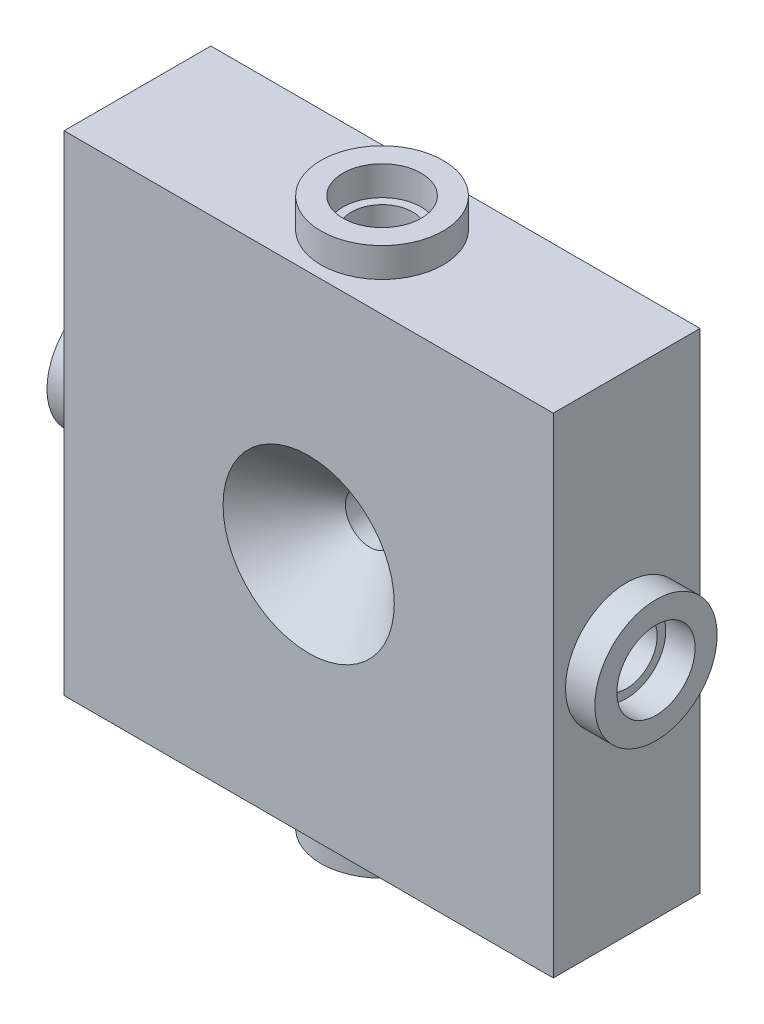
ISO-10303-21;
HEADER;
FILE_DESCRIPTION(('STEP AP214'),'2;1');
FILE_NAME('part.step','',(''),(''),'','','');
FILE_SCHEMA(('AUTOMOTIVE_DESIGN { 1 0 10303 214 1 1 1 1 }'));
ENDSEC;
DATA;
#1=APPLICATION_CONTEXT('core data for automotive mechanical design processes');
#2=APPLICATION_PROTOCOL_DEFINITION('international standard','automotive_design',2000,#1);
#3=PRODUCT_CONTEXT('',#1,'mechanical');
#4=PRODUCT('Part','Part','',(#3));
#5=PRODUCT_RELATED_PRODUCT_CATEGORY('part','',(#4));
#6=PRODUCT_DEFINITION_FORMATION('','',#4);
#7=PRODUCT_DEFINITION_CONTEXT('part definition',#1,'design');
#8=PRODUCT_DEFINITION('design','',#6,#7);
#9=PRODUCT_DEFINITION_SHAPE('','',#8);
#10=(LENGTH_UNIT() NAMED_UNIT(*) SI_UNIT(.MILLI.,.METRE.));
#11=(NAMED_UNIT(*) PLANE_ANGLE_UNIT() SI_UNIT($,.RADIAN.));
#12=(NAMED_UNIT(*) SI_UNIT($,.STERADIAN.) SOLID_ANGLE_UNIT());
#13=UNCERTAINTY_MEASURE_WITH_UNIT(LENGTH_MEASURE(1.E-05),#10,'distance_accuracy_value','');
#14=(GEOMETRIC_REPRESENTATION_CONTEXT(3) GLOBAL_UNCERTAINTY_ASSIGNED_CONTEXT((#13)) GLOBAL_UNIT_ASSIGNED_CONTEXT((#10,
#11,#12)) REPRESENTATION_CONTEXT('',''));
#15=CARTESIAN_POINT('',(0.,0.,0.));
#16=DIRECTION('',(0.,0.,1.));
#17=DIRECTION('',(1.,0.,0.));
#18=AXIS2_PLACEMENT_3D('',#15,#16,#17);
#19=CARTESIAN_POINT('',(-11.2,0.,0.));
#20=DIRECTION('',(-1.,0.,0.));
#21=DIRECTION('',(0.,0.,1.));
#22=AXIS2_PLACEMENT_3D('',#19,#20,#21);
#23=PLANE('',#22);
#24=CARTESIAN_POINT('',(-11.2,0.,0.));
#25=DIRECTION('',(-1.,0.,0.));
#26=DIRECTION('',(0.,0.,1.));
#27=AXIS2_PLACEMENT_3D('',#24,#25,#26);
#28=CIRCLE('',#27,2.5);
#29=CARTESIAN_POINT('',(-11.2,0.,2.5));
#30=VERTEX_POINT('',#29);
#31=EDGE_CURVE('E11',#30,#30,#28,.T.);
#32=ORIENTED_EDGE('',*,*,#31,.T.);
#33=EDGE_LOOP('',(#32));
#34=FACE_BOUND('',#33,.T.);
#35=CARTESIAN_POINT('',(-11.2,0.,0.));
#36=DIRECTION('',(-1.,0.,0.));
#37=DIRECTION('',(0.,0.,1.));
#38=AXIS2_PLACEMENT_3D('',#35,#36,#37);
#39=CIRCLE('',#38,1.6);
#40=CARTESIAN_POINT('',(-11.2,0.,1.6));
#41=VERTEX_POINT('',#40);
#42=EDGE_CURVE('E55',#41,#41,#39,.T.);
#43=ORIENTED_EDGE('',*,*,#42,.F.);
#44=EDGE_LOOP('',(#43));
#45=FACE_BOUND('',#44,.T.);
#46=ADVANCED_FACE('F44',(#34,#45),#23,.T.);
#47=CARTESIAN_POINT('',(-10.,0.,0.));
#48=DIRECTION('',(-1.,0.,0.));
#49=DIRECTION('',(0.,0.,1.));
#50=AXIS2_PLACEMENT_3D('',#47,#48,#49);
#51=PLANE('',#50);
#52=CARTESIAN_POINT('',(-10.,0.,0.));
#53=DIRECTION('',(-1.,0.,0.));
#54=DIRECTION('',(0.,0.,1.));
#55=AXIS2_PLACEMENT_3D('',#52,#53,#54);
#56=CIRCLE('',#55,2.5);
#57=CARTESIAN_POINT('',(-10.,0.,2.5));
#58=VERTEX_POINT('',#57);
#59=EDGE_CURVE('E48',#58,#58,#56,.T.);
#60=ORIENTED_EDGE('',*,*,#59,.F.);
#61=EDGE_LOOP('',(#60));
#62=FACE_BOUND('',#61,.T.);
#63=CARTESIAN_POINT('',(-10.,0.,0.));
#64=DIRECTION('',(-1.,0.,0.));
#65=DIRECTION('',(0.,0.,1.));
#66=AXIS2_PLACEMENT_3D('',#63,#64,#65);
#67=CIRCLE('',#66,1.6);
#68=CARTESIAN_POINT('',(-10.,0.,1.6));
#69=VERTEX_POINT('',#68);
#70=EDGE_CURVE('E57',#69,#69,#67,.T.);
#71=ORIENTED_EDGE('',*,*,#70,.T.);
#72=EDGE_LOOP('',(#71));
#73=FACE_BOUND('',#72,.T.);
#74=ADVANCED_FACE('F67',(#62,#73),#51,.F.);
#75=CARTESIAN_POINT('',(-11.2,0.,0.));
#76=DIRECTION('',(1.,0.,0.));
#77=DIRECTION('',(0.,0.,-1.));
#78=AXIS2_PLACEMENT_3D('',#75,#76,#77);
#79=CYLINDRICAL_SURFACE('',#78,2.5);
#80=ORIENTED_EDGE('',*,*,#31,.F.);
#81=EDGE_LOOP('',(#80));
#82=FACE_BOUND('',#81,.T.);
#83=ORIENTED_EDGE('',*,*,#59,.T.);
#84=EDGE_LOOP('',(#83));
#85=FACE_BOUND('',#84,.T.);
#86=ADVANCED_FACE('F46',(#82,#85),#79,.T.);
#87=CARTESIAN_POINT('',(-11.2,0.,0.));
#88=DIRECTION('',(1.,0.,0.));
#89=DIRECTION('',(0.,0.,-1.));
#90=AXIS2_PLACEMENT_3D('',#87,#88,#89);
#91=CYLINDRICAL_SURFACE('',#90,1.6);
#92=ORIENTED_EDGE('',*,*,#42,.T.);
#93=EDGE_LOOP('',(#92));
#94=FACE_BOUND('',#93,.T.);
#95=ORIENTED_EDGE('',*,*,#70,.F.);
#96=EDGE_LOOP('',(#95));
#97=FACE_BOUND('',#96,.T.);
#98=ADVANCED_FACE('F63',(#94,#97),#91,.F.);
#99=CLOSED_SHELL('',(#46,#74,#86,#98));
#100=MANIFOLD_SOLID_BREP('B2',#99);
#101=CARTESIAN_POINT('',(1.05611801903282E-13,-11.2,0.));
#102=DIRECTION('',(0.,-1.,0.));
#103=DIRECTION('',(0.,0.,1.));
#104=AXIS2_PLACEMENT_3D('',#101,#102,#103);
#105=PLANE('',#104);
#106=CARTESIAN_POINT('',(1.05611801903282E-13,-11.2,0.));
#107=DIRECTION('',(0.,-1.,0.));
#108=DIRECTION('',(0.,0.,1.));
#109=AXIS2_PLACEMENT_3D('',#106,#107,#108);
#110=CIRCLE('',#109,2.5);
#111=CARTESIAN_POINT('',(1.05244407863538E-13,-11.2,2.5));
#112=VERTEX_POINT('',#111);
#113=EDGE_CURVE('E43',#112,#112,#110,.T.);
#114=ORIENTED_EDGE('',*,*,#113,.T.);
#115=EDGE_LOOP('',(#114));
#116=FACE_BOUND('',#115,.T.);
#117=CARTESIAN_POINT('',(1.05611801903282E-13,-11.2,0.));
#118=DIRECTION('',(0.,-1.,0.));
#119=DIRECTION('',(0.,0.,1.));
#120=AXIS2_PLACEMENT_3D('',#117,#118,#119);
#121=CIRCLE('',#120,1.6);
#122=CARTESIAN_POINT('',(1.05376669717846E-13,-11.2,1.6));
#123=VERTEX_POINT('',#122);
#124=EDGE_CURVE('E145',#123,#123,#121,.T.);
#125=ORIENTED_EDGE('',*,*,#124,.F.);
#126=EDGE_LOOP('',(#125));
#127=FACE_BOUND('',#126,.T.);
#128=ADVANCED_FACE('F134',(#116,#127),#105,.T.);
#129=CARTESIAN_POINT('',(1.05611801903282E-13,-10.,0.));
#130=DIRECTION('',(0.,-1.,0.));
#131=DIRECTION('',(0.,0.,1.));
#132=AXIS2_PLACEMENT_3D('',#129,#130,#131);
#133=PLANE('',#132);
#134=CARTESIAN_POINT('',(1.05611801903282E-13,-10.,0.));
#135=DIRECTION('',(0.,-1.,0.));
#136=DIRECTION('',(0.,0.,1.));
#137=AXIS2_PLACEMENT_3D('',#134,#135,#136);
#138=CIRCLE('',#137,2.5);
#139=CARTESIAN_POINT('',(1.05244407863538E-13,-10.,2.5));
#140=VERTEX_POINT('',#139);
#141=EDGE_CURVE('E138',#140,#140,#138,.T.);
#142=ORIENTED_EDGE('',*,*,#141,.F.);
#143=EDGE_LOOP('',(#142));
#144=FACE_BOUND('',#143,.T.);
#145=CARTESIAN_POINT('',(1.05611801903282E-13,-10.,0.));
#146=DIRECTION('',(0.,-1.,0.));
#147=DIRECTION('',(0.,0.,1.));
#148=AXIS2_PLACEMENT_3D('',#145,#146,#147);
#149=CIRCLE('',#148,1.6);
#150=CARTESIAN_POINT('',(1.05376669717846E-13,-10.,1.6));
#151=VERTEX_POINT('',#150);
#152=EDGE_CURVE('E147',#151,#151,#149,.T.);
#153=ORIENTED_EDGE('',*,*,#152,.T.);
#154=EDGE_LOOP('',(#153));
#155=FACE_BOUND('',#154,.T.);
#156=ADVANCED_FACE('F157',(#144,#155),#133,.F.);
#157=CARTESIAN_POINT('',(1.05611801903282E-13,-11.2,0.));
#158=DIRECTION('',(0.,1.,0.));
#159=DIRECTION('',(0.,0.,-1.));
#160=AXIS2_PLACEMENT_3D('',#157,#158,#159);
#161=CYLINDRICAL_SURFACE('',#160,2.5);
#162=ORIENTED_EDGE('',*,*,#113,.F.);
#163=EDGE_LOOP('',(#162));
#164=FACE_BOUND('',#163,.T.);
#165=ORIENTED_EDGE('',*,*,#141,.T.);
#166=EDGE_LOOP('',(#165));
#167=FACE_BOUND('',#166,.T.);
#168=ADVANCED_FACE('F136',(#164,#167),#161,.T.);
#169=CARTESIAN_POINT('',(1.05611801903282E-13,-11.2,0.));
#170=DIRECTION('',(0.,1.,0.));
#171=DIRECTION('',(0.,0.,-1.));
#172=AXIS2_PLACEMENT_3D('',#169,#170,#171);
#173=CYLINDRICAL_SURFACE('',#172,1.6);
#174=ORIENTED_EDGE('',*,*,#124,.T.);
#175=EDGE_LOOP('',(#174));
#176=FACE_BOUND('',#175,.T.);
#177=ORIENTED_EDGE('',*,*,#152,.F.);
#178=EDGE_LOOP('',(#177));
#179=FACE_BOUND('',#178,.T.);
#180=ADVANCED_FACE('F153',(#176,#179),#173,.F.);
#181=CLOSED_SHELL('',(#128,#156,#168,#180));
#182=MANIFOLD_SOLID_BREP('B6',#181);
#183=CARTESIAN_POINT('',(11.2,0.,0.));
#184=DIRECTION('',(1.,0.,0.));
#185=DIRECTION('',(0.,0.,1.));
#186=AXIS2_PLACEMENT_3D('',#183,#184,#185);
#187=PLANE('',#186);
#188=CARTESIAN_POINT('',(11.2,0.,0.));
#189=DIRECTION('',(1.,0.,0.));
#190=DIRECTION('',(0.,0.,1.));
#191=AXIS2_PLACEMENT_3D('',#188,#189,#190);
#192=CIRCLE('',#191,2.5);
#193=CARTESIAN_POINT('',(11.2,0.,2.5));
#194=VERTEX_POINT('',#193);
#195=EDGE_CURVE('E133',#194,#194,#192,.T.);
#196=ORIENTED_EDGE('',*,*,#195,.T.);
#197=EDGE_LOOP('',(#196));
#198=FACE_BOUND('',#197,.T.);
#199=CARTESIAN_POINT('',(11.2,0.,0.));
#200=DIRECTION('',(1.,0.,0.));
#201=DIRECTION('',(0.,0.,1.));
#202=AXIS2_PLACEMENT_3D('',#199,#200,#201);
#203=CIRCLE('',#202,1.6);
#204=CARTESIAN_POINT('',(11.2,0.,1.6));
#205=VERTEX_POINT('',#204);
#206=EDGE_CURVE('E235',#205,#205,#203,.T.);
#207=ORIENTED_EDGE('',*,*,#206,.F.);
#208=EDGE_LOOP('',(#207));
#209=FACE_BOUND('',#208,.T.);
#210=ADVANCED_FACE('F224',(#198,#209),#187,.T.);
#211=CARTESIAN_POINT('',(10.,0.,0.));
#212=DIRECTION('',(1.,0.,0.));
#213=DIRECTION('',(0.,0.,1.));
#214=AXIS2_PLACEMENT_3D('',#211,#212,#213);
#215=PLANE('',#214);
#216=CARTESIAN_POINT('',(10.,0.,0.));
#217=DIRECTION('',(1.,0.,0.));
#218=DIRECTION('',(0.,0.,1.));
#219=AXIS2_PLACEMENT_3D('',#216,#217,#218);
#220=CIRCLE('',#219,2.5);
#221=CARTESIAN_POINT('',(10.,0.,2.5));
#222=VERTEX_POINT('',#221);
#223=EDGE_CURVE('E228',#222,#222,#220,.T.);
#224=ORIENTED_EDGE('',*,*,#223,.F.);
#225=EDGE_LOOP('',(#224));
#226=FACE_BOUND('',#225,.T.);
#227=CARTESIAN_POINT('',(10.,0.,0.));
#228=DIRECTION('',(1.,0.,0.));
#229=DIRECTION('',(0.,0.,1.));
#230=AXIS2_PLACEMENT_3D('',#227,#228,#229);
#231=CIRCLE('',#230,1.6);
#232=CARTESIAN_POINT('',(10.,0.,1.6));
#233=VERTEX_POINT('',#232);
#234=EDGE_CURVE('E237',#233,#233,#231,.T.);
#235=ORIENTED_EDGE('',*,*,#234,.T.);
#236=EDGE_LOOP('',(#235));
#237=FACE_BOUND('',#236,.T.);
#238=ADVANCED_FACE('F247',(#226,#237),#215,.F.);
#239=CARTESIAN_POINT('',(11.2,0.,0.));
#240=DIRECTION('',(-1.,0.,0.));
#241=DIRECTION('',(0.,0.,-1.));
#242=AXIS2_PLACEMENT_3D('',#239,#240,#241);
#243=CYLINDRICAL_SURFACE('',#242,2.5);
#244=ORIENTED_EDGE('',*,*,#195,.F.);
#245=EDGE_LOOP('',(#244));
#246=FACE_BOUND('',#245,.T.);
#247=ORIENTED_EDGE('',*,*,#223,.T.);
#248=EDGE_LOOP('',(#247));
#249=FACE_BOUND('',#248,.T.);
#250=ADVANCED_FACE('F226',(#246,#249),#243,.T.);
#251=CARTESIAN_POINT('',(11.2,0.,0.));
#252=DIRECTION('',(-1.,0.,0.));
#253=DIRECTION('',(0.,0.,-1.));
#254=AXIS2_PLACEMENT_3D('',#251,#252,#253);
#255=CYLINDRICAL_SURFACE('',#254,1.6);
#256=ORIENTED_EDGE('',*,*,#206,.T.);
#257=EDGE_LOOP('',(#256));
#258=FACE_BOUND('',#257,.T.);
#259=ORIENTED_EDGE('',*,*,#234,.F.);
#260=EDGE_LOOP('',(#259));
#261=FACE_BOUND('',#260,.T.);
#262=ADVANCED_FACE('F243',(#258,#261),#255,.F.);
#263=CLOSED_SHELL('',(#210,#238,#250,#262));
#264=MANIFOLD_SOLID_BREP('B38',#263);
#265=CARTESIAN_POINT('',(-1.05611801903282E-13,11.2,0.));
#266=DIRECTION('',(0.,1.,0.));
#267=DIRECTION('',(0.,0.,1.));
#268=AXIS2_PLACEMENT_3D('',#265,#266,#267);
#269=PLANE('',#268);
#270=CARTESIAN_POINT('',(-1.05611801903282E-13,11.2,0.));
#271=DIRECTION('',(0.,1.,0.));
#272=DIRECTION('',(0.,0.,1.));
#273=AXIS2_PLACEMENT_3D('',#270,#271,#272);
#274=CIRCLE('',#273,2.5);
#275=CARTESIAN_POINT('',(-1.05611801903282E-13,11.2,2.5));
#276=VERTEX_POINT('',#275);
#277=EDGE_CURVE('E223',#276,#276,#274,.T.);
#278=ORIENTED_EDGE('',*,*,#277,.T.);
#279=EDGE_LOOP('',(#278));
#280=FACE_BOUND('',#279,.T.);
#281=CARTESIAN_POINT('',(-1.05611801903282E-13,11.2,0.));
#282=DIRECTION('',(0.,1.,0.));
#283=DIRECTION('',(0.,0.,1.));
#284=AXIS2_PLACEMENT_3D('',#281,#282,#283);
#285=CIRCLE('',#284,1.6);
#286=CARTESIAN_POINT('',(-1.05611801903282E-13,11.2,1.6));
#287=VERTEX_POINT('',#286);
#288=EDGE_CURVE('E326',#287,#287,#285,.T.);
#289=ORIENTED_EDGE('',*,*,#288,.F.);
#290=EDGE_LOOP('',(#289));
#291=FACE_BOUND('',#290,.T.);
#292=ADVANCED_FACE('F315',(#280,#291),#269,.T.);
#293=CARTESIAN_POINT('',(-1.05611801903282E-13,10.,0.));
#294=DIRECTION('',(0.,1.,0.));
#295=DIRECTION('',(0.,0.,1.));
#296=AXIS2_PLACEMENT_3D('',#293,#294,#295);
#297=PLANE('',#296);
#298=CARTESIAN_POINT('',(-1.05611801903282E-13,10.,0.));
#299=DIRECTION('',(0.,1.,0.));
#300=DIRECTION('',(0.,0.,1.));
#301=AXIS2_PLACEMENT_3D('',#298,#299,#300);
#302=CIRCLE('',#301,2.5);
#303=CARTESIAN_POINT('',(-1.05611801903282E-13,10.,2.5));
#304=VERTEX_POINT('',#303);
#305=EDGE_CURVE('E319',#304,#304,#302,.T.);
#306=ORIENTED_EDGE('',*,*,#305,.F.);
#307=EDGE_LOOP('',(#306));
#308=FACE_BOUND('',#307,.T.);
#309=CARTESIAN_POINT('',(-1.05611801903282E-13,10.,0.));
#310=DIRECTION('',(0.,1.,0.));
#311=DIRECTION('',(0.,0.,1.));
#312=AXIS2_PLACEMENT_3D('',#309,#310,#311);
#313=CIRCLE('',#312,1.6);
#314=CARTESIAN_POINT('',(-1.05611801903282E-13,10.,1.6));
#315=VERTEX_POINT('',#314);
#316=EDGE_CURVE('E328',#315,#315,#313,.T.);
#317=ORIENTED_EDGE('',*,*,#316,.T.);
#318=EDGE_LOOP('',(#317));
#319=FACE_BOUND('',#318,.T.);
#320=ADVANCED_FACE('F338',(#308,#319),#297,.F.);
#321=CARTESIAN_POINT('',(-1.05611801903282E-13,11.2,0.));
#322=DIRECTION('',(0.,-1.,0.));
#323=DIRECTION('',(0.,0.,-1.));
#324=AXIS2_PLACEMENT_3D('',#321,#322,#323);
#325=CYLINDRICAL_SURFACE('',#324,2.5);
#326=ORIENTED_EDGE('',*,*,#277,.F.);
#327=EDGE_LOOP('',(#326));
#328=FACE_BOUND('',#327,.T.);
#329=ORIENTED_EDGE('',*,*,#305,.T.);
#330=EDGE_LOOP('',(#329));
#331=FACE_BOUND('',#330,.T.);
#332=ADVANCED_FACE('F317',(#328,#331),#325,.T.);
#333=CARTESIAN_POINT('',(-1.05611801903282E-13,11.2,0.));
#334=DIRECTION('',(0.,-1.,0.));
#335=DIRECTION('',(0.,0.,-1.));
#336=AXIS2_PLACEMENT_3D('',#333,#334,#335);
#337=CYLINDRICAL_SURFACE('',#336,1.6);
#338=ORIENTED_EDGE('',*,*,#288,.T.);
#339=EDGE_LOOP('',(#338));
#340=FACE_BOUND('',#339,.T.);
#341=ORIENTED_EDGE('',*,*,#316,.F.);
#342=EDGE_LOOP('',(#341));
#343=FACE_BOUND('',#342,.T.);
#344=ADVANCED_FACE('F334',(#340,#343),#337,.F.);
#345=CLOSED_SHELL('',(#292,#320,#332,#344));
#346=MANIFOLD_SOLID_BREP('B128',#345);
#347=CARTESIAN_POINT('',(0.,0.,3.));
#348=DIRECTION('',(0.,0.,-1.));
#349=DIRECTION('',(-1.,0.,0.));
#350=AXIS2_PLACEMENT_3D('',#347,#348,#349);
#351=CYLINDRICAL_SURFACE('',#350,1.);
#352=CARTESIAN_POINT('',(0.,0.,0.5));
#353=DIRECTION('',(0.,0.,-1.));
#354=DIRECTION('',(-1.,0.,0.));
#355=AXIS2_PLACEMENT_3D('',#352,#353,#354);
#356=CIRCLE('',#355,0.999999999999998);
#357=CARTESIAN_POINT('',(0.999999999999999,0.,0.5));
#358=VERTEX_POINT('',#357);
#359=EDGE_CURVE('E481',#358,#358,#356,.T.);
#360=ORIENTED_EDGE('',*,*,#359,.F.);
#361=EDGE_LOOP('',(#360));
#362=FACE_BOUND('',#361,.T.);
#363=CARTESIAN_POINT('',(0.,0.,-0.5));
#364=DIRECTION('',(0.,0.,-1.));
#365=DIRECTION('',(-1.,0.,0.));
#366=AXIS2_PLACEMENT_3D('',#363,#364,#365);
#367=CIRCLE('',#366,0.999999999999998);
#368=CARTESIAN_POINT('',(0.999999999999999,0.,-0.5));
#369=VERTEX_POINT('',#368);
#370=EDGE_CURVE('E463',#369,#369,#367,.T.);
#371=ORIENTED_EDGE('',*,*,#370,.T.);
#372=EDGE_LOOP('',(#371));
#373=FACE_BOUND('',#372,.T.);
#374=ADVANCED_FACE('F377',(#362,#373),#351,.F.);
#375=CARTESIAN_POINT('',(0.,0.,3.));
#376=DIRECTION('',(0.,0.,1.));
#377=DIRECTION('',(1.,0.,0.));
#378=AXIS2_PLACEMENT_3D('',#375,#376,#377);
#379=PLANE('',#378);
#380=CARTESIAN_POINT('',(0.,0.,3.));
#381=DIRECTION('',(0.,0.,-1.));
#382=DIRECTION('',(-1.,0.,0.));
#383=AXIS2_PLACEMENT_3D('',#380,#381,#382);
#384=CIRCLE('',#383,3.50000000000003);
#385=CARTESIAN_POINT('',(3.50000000000003,0.,3.));
#386=VERTEX_POINT('',#385);
#387=EDGE_CURVE('E478',#386,#386,#384,.T.);
#388=ORIENTED_EDGE('',*,*,#387,.T.);
#389=EDGE_LOOP('',(#388));
#390=FACE_BOUND('',#389,.T.);
#391=DIRECTION('',(0.,1.,0.));
#392=VECTOR('',#391,1.);
#393=CARTESIAN_POINT('',(10.,10.,3.));
#394=LINE('',#393,#392);
#395=CARTESIAN_POINT('',(10.,-10.,3.));
#396=VERTEX_POINT('',#395);
#397=CARTESIAN_POINT('',(10.,10.,3.));
#398=VERTEX_POINT('',#397);
#399=EDGE_CURVE('E484',#396,#398,#394,.T.);
#400=ORIENTED_EDGE('',*,*,#399,.T.);
#401=DIRECTION('',(-1.,0.,0.));
#402=VECTOR('',#401,1.);
#403=CARTESIAN_POINT('',(-10.,10.,3.));
#404=LINE('',#403,#402);
#405=CARTESIAN_POINT('',(-10.,10.,3.));
#406=VERTEX_POINT('',#405);
#407=EDGE_CURVE('E486',#398,#406,#404,.T.);
#408=ORIENTED_EDGE('',*,*,#407,.T.);
#409=DIRECTION('',(0.,-1.,0.));
#410=VECTOR('',#409,1.);
#411=CARTESIAN_POINT('',(-10.,10.,3.));
#412=LINE('',#411,#410);
#413=CARTESIAN_POINT('',(-10.,-10.,3.));
#414=VERTEX_POINT('',#413);
#415=EDGE_CURVE('E397',#406,#414,#412,.T.);
#416=ORIENTED_EDGE('',*,*,#415,.T.);
#417=DIRECTION('',(1.,0.,0.));
#418=VECTOR('',#417,1.);
#419=CARTESIAN_POINT('',(-10.,-10.,3.));
#420=LINE('',#419,#418);
#421=EDGE_CURVE('E392',#414,#396,#420,.T.);
#422=ORIENTED_EDGE('',*,*,#421,.T.);
#423=EDGE_LOOP('',(#400,#408,#416,#422));
#424=FACE_BOUND('',#423,.T.);
#425=ADVANCED_FACE('F509',(#390,#424),#379,.T.);
#426=CARTESIAN_POINT('',(10.,10.,3.));
#427=DIRECTION('',(-1.,0.,0.));
#428=DIRECTION('',(0.,-1.,0.));
#429=AXIS2_PLACEMENT_3D('',#426,#427,#428);
#430=PLANE('',#429);
#431=CARTESIAN_POINT('',(10.,0.,0.));
#432=DIRECTION('',(1.,0.,0.));
#433=DIRECTION('',(0.,0.,-1.));
#434=AXIS2_PLACEMENT_3D('',#431,#432,#433);
#435=CIRCLE('',#434,1.25);
#436=CARTESIAN_POINT('',(10.,0.,-1.25));
#437=VERTEX_POINT('',#436);
#438=EDGE_CURVE('E437',#437,#437,#435,.T.);
#439=ORIENTED_EDGE('',*,*,#438,.F.);
#440=EDGE_LOOP('',(#439));
#441=FACE_BOUND('',#440,.T.);
#442=DIRECTION('',(0.,0.,-1.));
#443=VECTOR('',#442,1.);
#444=CARTESIAN_POINT('',(10.,-10.,3.));
#445=LINE('',#444,#443);
#446=CARTESIAN_POINT('',(10.,-10.,-3.));
#447=VERTEX_POINT('',#446);
#448=EDGE_CURVE('E490',#396,#447,#445,.T.);
#449=ORIENTED_EDGE('',*,*,#448,.T.);
#450=DIRECTION('',(0.,1.,0.));
#451=VECTOR('',#450,1.);
#452=CARTESIAN_POINT('',(10.,10.,-3.));
#453=LINE('',#452,#451);
#454=CARTESIAN_POINT('',(10.,10.,-3.));
#455=VERTEX_POINT('',#454);
#456=EDGE_CURVE('E466',#447,#455,#453,.T.);
#457=ORIENTED_EDGE('',*,*,#456,.T.);
#458=DIRECTION('',(0.,0.,-1.));
#459=VECTOR('',#458,1.);
#460=CARTESIAN_POINT('',(10.,10.,3.));
#461=LINE('',#460,#459);
#462=EDGE_CURVE('E313',#398,#455,#461,.T.);
#463=ORIENTED_EDGE('',*,*,#462,.F.);
#464=ORIENTED_EDGE('',*,*,#399,.F.);
#465=EDGE_LOOP('',(#449,#457,#463,#464));
#466=FACE_BOUND('',#465,.T.);
#467=ADVANCED_FACE('F379',(#441,#466),#430,.F.);
#468=CARTESIAN_POINT('',(-10.,10.,3.));
#469=DIRECTION('',(0.,-1.,0.));
#470=DIRECTION('',(0.,0.,-1.));
#471=AXIS2_PLACEMENT_3D('',#468,#469,#470);
#472=PLANE('',#471);
#473=CARTESIAN_POINT('',(-1.05611801903282E-13,10.,0.));
#474=DIRECTION('',(0.,1.,0.));
#475=DIRECTION('',(0.,0.,1.));
#476=AXIS2_PLACEMENT_3D('',#473,#474,#475);
#477=CIRCLE('',#476,1.25);
#478=CARTESIAN_POINT('',(-1.05611801903282E-13,10.,1.25));
#479=VERTEX_POINT('',#478);
#480=EDGE_CURVE('E438',#479,#479,#477,.T.);
#481=ORIENTED_EDGE('',*,*,#480,.F.);
#482=EDGE_LOOP('',(#481));
#483=FACE_BOUND('',#482,.T.);
#484=ORIENTED_EDGE('',*,*,#462,.T.);
#485=DIRECTION('',(-1.,0.,0.));
#486=VECTOR('',#485,1.);
#487=CARTESIAN_POINT('',(-10.,10.,-3.));
#488=LINE('',#487,#486);
#489=CARTESIAN_POINT('',(-10.,10.,-3.));
#490=VERTEX_POINT('',#489);
#491=EDGE_CURVE('E469',#455,#490,#488,.T.);
#492=ORIENTED_EDGE('',*,*,#491,.T.);
#493=DIRECTION('',(0.,0.,-1.));
#494=VECTOR('',#493,1.);
#495=CARTESIAN_POINT('',(-10.,10.,3.));
#496=LINE('',#495,#494);
#497=EDGE_CURVE('E385',#406,#490,#496,.T.);
#498=ORIENTED_EDGE('',*,*,#497,.F.);
#499=ORIENTED_EDGE('',*,*,#407,.F.);
#500=EDGE_LOOP('',(#484,#492,#498,#499));
#501=FACE_BOUND('',#500,.T.);
#502=ADVANCED_FACE('F500',(#483,#501),#472,.F.);
#503=CARTESIAN_POINT('',(-10.,10.,3.));
#504=DIRECTION('',(1.,0.,0.));
#505=DIRECTION('',(0.,1.,0.));
#506=AXIS2_PLACEMENT_3D('',#503,#504,#505);
#507=PLANE('',#506);
#508=CARTESIAN_POINT('',(-10.,0.,0.));
#509=DIRECTION('',(-1.,0.,0.));
#510=DIRECTION('',(0.,0.,1.));
#511=AXIS2_PLACEMENT_3D('',#508,#509,#510);
#512=CIRCLE('',#511,1.25);
#513=CARTESIAN_POINT('',(-10.,0.,1.25));
#514=VERTEX_POINT('',#513);
#515=EDGE_CURVE('E454',#514,#514,#512,.T.);
#516=ORIENTED_EDGE('',*,*,#515,.F.);
#517=EDGE_LOOP('',(#516));
#518=FACE_BOUND('',#517,.T.);
#519=ORIENTED_EDGE('',*,*,#497,.T.);
#520=DIRECTION('',(0.,-1.,0.));
#521=VECTOR('',#520,1.);
#522=CARTESIAN_POINT('',(-10.,10.,-3.));
#523=LINE('',#522,#521);
#524=CARTESIAN_POINT('',(-10.,-10.,-3.));
#525=VERTEX_POINT('',#524);
#526=EDGE_CURVE('E472',#490,#525,#523,.T.);
#527=ORIENTED_EDGE('',*,*,#526,.T.);
#528=DIRECTION('',(0.,0.,-1.));
#529=VECTOR('',#528,1.);
#530=CARTESIAN_POINT('',(-10.,-10.,3.));
#531=LINE('',#530,#529);
#532=EDGE_CURVE('E492',#414,#525,#531,.T.);
#533=ORIENTED_EDGE('',*,*,#532,.F.);
#534=ORIENTED_EDGE('',*,*,#415,.F.);
#535=EDGE_LOOP('',(#519,#527,#533,#534));
#536=FACE_BOUND('',#535,.T.);
#537=ADVANCED_FACE('F495',(#518,#536),#507,.F.);
#538=CARTESIAN_POINT('',(-10.,-10.,3.));
#539=DIRECTION('',(0.,1.,0.));
#540=DIRECTION('',(0.,0.,1.));
#541=AXIS2_PLACEMENT_3D('',#538,#539,#540);
#542=PLANE('',#541);
#543=CARTESIAN_POINT('',(0.,-10.,0.));
#544=DIRECTION('',(0.,-1.,0.));
#545=DIRECTION('',(0.,0.,-1.));
#546=AXIS2_PLACEMENT_3D('',#543,#544,#545);
#547=CIRCLE('',#546,1.25);
#548=CARTESIAN_POINT('',(0.,-10.,-1.25));
#549=VERTEX_POINT('',#548);
#550=EDGE_CURVE('E448',#549,#549,#547,.T.);
#551=ORIENTED_EDGE('',*,*,#550,.F.);
#552=EDGE_LOOP('',(#551));
#553=FACE_BOUND('',#552,.T.);
#554=ORIENTED_EDGE('',*,*,#532,.T.);
#555=DIRECTION('',(1.,0.,0.));
#556=VECTOR('',#555,1.);
#557=CARTESIAN_POINT('',(-10.,-10.,-3.));
#558=LINE('',#557,#556);
#559=EDGE_CURVE('E475',#525,#447,#558,.T.);
#560=ORIENTED_EDGE('',*,*,#559,.T.);
#561=ORIENTED_EDGE('',*,*,#448,.F.);
#562=ORIENTED_EDGE('',*,*,#421,.F.);
#563=EDGE_LOOP('',(#554,#560,#561,#562));
#564=FACE_BOUND('',#563,.T.);
#565=ADVANCED_FACE('F506',(#553,#564),#542,.F.);
#566=CARTESIAN_POINT('',(0.,0.,3.));
#567=DIRECTION('',(0.,0.,1.));
#568=DIRECTION('',(1.,0.,0.));
#569=AXIS2_PLACEMENT_3D('',#566,#567,#568);
#570=CONICAL_SURFACE('',#569,3.50000000000003,0.785398163397454);
#571=CARTESIAN_POINT('',(0.999999999999999,0.,0.5));
#572=CARTESIAN_POINT('',(1.02604166666667,0.,0.526041666666667));
#573=CARTESIAN_POINT('',(1.05208333333333,0.,0.552083333333334));
#574=CARTESIAN_POINT('',(1.10416666666667,0.,0.604166666666667));
#575=CARTESIAN_POINT('',(1.13020833333333,0.,0.630208333333334));
#576=CARTESIAN_POINT('',(1.18229166666667,0.,0.682291666666667));
#577=CARTESIAN_POINT('',(1.20833333333333,0.,0.708333333333334));
#578=CARTESIAN_POINT('',(1.26041666666667,0.,0.760416666666667));
#579=CARTESIAN_POINT('',(1.28645833333334,0.,0.786458333333334));
#580=CARTESIAN_POINT('',(1.33854166666667,0.,0.838541666666667));
#581=CARTESIAN_POINT('',(1.36458333333334,0.,0.864583333333334));
#582=CARTESIAN_POINT('',(1.41666666666667,0.,0.916666666666667));
#583=CARTESIAN_POINT('',(1.44270833333334,0.,0.942708333333334));
#584=CARTESIAN_POINT('',(1.49479166666667,0.,0.994791666666667));
#585=CARTESIAN_POINT('',(1.52083333333334,0.,1.02083333333333));
#586=CARTESIAN_POINT('',(1.57291666666667,0.,1.07291666666667));
#587=CARTESIAN_POINT('',(1.59895833333334,0.,1.09895833333333));
#588=CARTESIAN_POINT('',(1.65104166666667,0.,1.15104166666667));
#589=CARTESIAN_POINT('',(1.67708333333334,0.,1.17708333333333));
#590=CARTESIAN_POINT('',(1.72916666666667,0.,1.22916666666667));
#591=CARTESIAN_POINT('',(1.75520833333334,0.,1.25520833333333));
#592=CARTESIAN_POINT('',(1.80729166666667,0.,1.30729166666667));
#593=CARTESIAN_POINT('',(1.83333333333334,0.,1.33333333333333));
#594=CARTESIAN_POINT('',(1.88541666666668,0.,1.38541666666667));
#595=CARTESIAN_POINT('',(1.91145833333334,0.,1.41145833333333));
#596=CARTESIAN_POINT('',(1.96354166666668,0.,1.46354166666667));
#597=CARTESIAN_POINT('',(1.98958333333334,0.,1.48958333333333));
#598=CARTESIAN_POINT('',(2.04166666666668,0.,1.54166666666667));
#599=CARTESIAN_POINT('',(2.06770833333334,0.,1.56770833333333));
#600=CARTESIAN_POINT('',(2.11979166666668,0.,1.61979166666667));
#601=CARTESIAN_POINT('',(2.14583333333334,0.,1.64583333333333));
#602=CARTESIAN_POINT('',(2.19791666666668,0.,1.69791666666667));
#603=CARTESIAN_POINT('',(2.22395833333335,0.,1.72395833333333));
#604=CARTESIAN_POINT('',(2.27604166666668,0.,1.77604166666667));
#605=CARTESIAN_POINT('',(2.30208333333335,0.,1.80208333333333));
#606=CARTESIAN_POINT('',(2.35416666666668,0.,1.85416666666667));
#607=CARTESIAN_POINT('',(2.38020833333335,0.,1.88020833333333));
#608=CARTESIAN_POINT('',(2.43229166666668,0.,1.93229166666667));
#609=CARTESIAN_POINT('',(2.45833333333335,0.,1.95833333333333));
#610=CARTESIAN_POINT('',(2.51041666666668,0.,2.01041666666667));
#611=CARTESIAN_POINT('',(2.53645833333335,0.,2.03645833333333));
#612=CARTESIAN_POINT('',(2.58854166666668,0.,2.08854166666667));
#613=CARTESIAN_POINT('',(2.61458333333335,0.,2.11458333333333));
#614=CARTESIAN_POINT('',(2.66666666666668,0.,2.16666666666667));
#615=CARTESIAN_POINT('',(2.69270833333335,0.,2.19270833333333));
#616=CARTESIAN_POINT('',(2.74479166666668,0.,2.24479166666667));
#617=CARTESIAN_POINT('',(2.77083333333335,0.,2.27083333333333));
#618=CARTESIAN_POINT('',(2.82291666666668,0.,2.32291666666667));
#619=CARTESIAN_POINT('',(2.84895833333335,0.,2.34895833333333));
#620=CARTESIAN_POINT('',(2.90104166666669,0.,2.40104166666667));
#621=CARTESIAN_POINT('',(2.92708333333335,0.,2.42708333333333));
#622=CARTESIAN_POINT('',(2.97916666666669,0.,2.47916666666667));
#623=CARTESIAN_POINT('',(3.00520833333335,0.,2.50520833333333));
#624=CARTESIAN_POINT('',(3.05729166666669,0.,2.55729166666667));
#625=CARTESIAN_POINT('',(3.08333333333335,0.,2.58333333333333));
#626=CARTESIAN_POINT('',(3.13541666666669,0.,2.63541666666667));
#627=CARTESIAN_POINT('',(3.16145833333336,0.,2.66145833333333));
#628=CARTESIAN_POINT('',(3.21354166666669,0.,2.71354166666667));
#629=CARTESIAN_POINT('',(3.23958333333336,0.,2.73958333333333));
#630=CARTESIAN_POINT('',(3.29166666666669,0.,2.79166666666667));
#631=CARTESIAN_POINT('',(3.31770833333336,0.,2.81770833333333));
#632=CARTESIAN_POINT('',(3.36979166666669,0.,2.86979166666667));
#633=CARTESIAN_POINT('',(3.39583333333336,0.,2.89583333333333));
#634=CARTESIAN_POINT('',(3.44791666666669,0.,2.94791666666667));
#635=CARTESIAN_POINT('',(3.47395833333336,0.,2.97395833333333));
#636=CARTESIAN_POINT('',(3.50000000000003,0.,3.));
#637=B_SPLINE_CURVE_WITH_KNOTS('',3,(#571,#572,#573,#574,#575,#576,#577,#578,#579,#580,#581,
#582,#583,#584,#585,#586,#587,#588,#589,#590,#591,#592,#593,#594,#595,#596,#597,#598,#599,#600,
#601,#602,#603,#604,#605,#606,#607,#608,#609,#610,#611,#612,#613,#614,#615,#616,#617,#618,#619,
#620,#621,#622,#623,#624,#625,#626,#627,#628,#629,#630,#631,#632,#633,#634,#635,#636),
.UNSPECIFIED.,.F.,.F.,(4,2,2,2,2,2,2,2,2,2,2,2,2,2,2,2,2,2,2,2,2,2,2,2,2,2,2,2,2,2,2,2,4),(0.,
0.110485434560399,0.220970869120798,0.331456303681196,0.441941738241594,0.552427172801993,
0.662912607362392,0.773398041922791,0.883883476483189,0.994368911043588,1.10485434560399,
1.21533978016439,1.32582521472478,1.43631064928518,1.54679608384558,1.65728151840598,
1.76776695296638,1.87825238752678,1.98873782208718,2.09922325664757,2.20970869120797,
2.32019412576837,2.43067956032877,2.54116499488917,2.65165042944957,2.76213586400997,
2.87262129857036,2.98310673313076,3.09359216769116,3.20407760225156,3.31456303681196,
3.42504847137236,3.53553390593276),.UNSPECIFIED.);
#638=EDGE_CURVE('BSEAM524',#358,#386,#637,.T.);
#639=ORIENTED_EDGE('',*,*,#359,.T.);
#640=ORIENTED_EDGE('',*,*,#387,.F.);
#641=ORIENTED_EDGE('',*,*,#638,.T.);
#642=ORIENTED_EDGE('',*,*,#638,.F.);
#643=EDGE_LOOP('',(#639,#641,#640,#642));
#644=FACE_BOUND('',#643,.T.);
#645=ADVANCED_FACE('F524',(#644),#570,.F.);
#646=CARTESIAN_POINT('',(0.,0.,-3.));
#647=DIRECTION('',(0.,0.,-1.));
#648=DIRECTION('',(1.,0.,0.));
#649=AXIS2_PLACEMENT_3D('',#646,#647,#648);
#650=PLANE('',#649);
#651=CARTESIAN_POINT('',(0.,0.,-3.));
#652=DIRECTION('',(0.,0.,-1.));
#653=DIRECTION('',(-1.,0.,0.));
#654=AXIS2_PLACEMENT_3D('',#651,#652,#653);
#655=CIRCLE('',#654,3.50000000000003);
#656=CARTESIAN_POINT('',(3.50000000000003,0.,-3.));
#657=VERTEX_POINT('',#656);
#658=EDGE_CURVE('E460',#657,#657,#655,.T.);
#659=ORIENTED_EDGE('',*,*,#658,.F.);
#660=EDGE_LOOP('',(#659));
#661=FACE_BOUND('',#660,.T.);
#662=ORIENTED_EDGE('',*,*,#456,.F.);
#663=ORIENTED_EDGE('',*,*,#559,.F.);
#664=ORIENTED_EDGE('',*,*,#526,.F.);
#665=ORIENTED_EDGE('',*,*,#491,.F.);
#666=EDGE_LOOP('',(#662,#663,#664,#665));
#667=FACE_BOUND('',#666,.T.);
#668=ADVANCED_FACE('F504',(#661,#667),#650,.T.);
#669=CARTESIAN_POINT('',(0.,0.,-3.));
#670=DIRECTION('',(0.,0.,-1.));
#671=DIRECTION('',(1.,0.,0.));
#672=AXIS2_PLACEMENT_3D('',#669,#670,#671);
#673=CONICAL_SURFACE('',#672,3.50000000000003,0.785398163397454);
#674=CARTESIAN_POINT('',(0.999999999999999,0.,-0.5));
#675=CARTESIAN_POINT('',(1.02604166666667,0.,-0.526041666666667));
#676=CARTESIAN_POINT('',(1.05208333333333,0.,-0.552083333333334));
#677=CARTESIAN_POINT('',(1.10416666666667,0.,-0.604166666666667));
#678=CARTESIAN_POINT('',(1.13020833333333,0.,-0.630208333333334));
#679=CARTESIAN_POINT('',(1.18229166666667,0.,-0.682291666666667));
#680=CARTESIAN_POINT('',(1.20833333333333,0.,-0.708333333333334));
#681=CARTESIAN_POINT('',(1.26041666666667,0.,-0.760416666666667));
#682=CARTESIAN_POINT('',(1.28645833333334,0.,-0.786458333333334));
#683=CARTESIAN_POINT('',(1.33854166666667,0.,-0.838541666666667));
#684=CARTESIAN_POINT('',(1.36458333333334,0.,-0.864583333333334));
#685=CARTESIAN_POINT('',(1.41666666666667,0.,-0.916666666666667));
#686=CARTESIAN_POINT('',(1.44270833333334,0.,-0.942708333333334));
#687=CARTESIAN_POINT('',(1.49479166666667,0.,-0.994791666666667));
#688=CARTESIAN_POINT('',(1.52083333333334,0.,-1.02083333333333));
#689=CARTESIAN_POINT('',(1.57291666666667,0.,-1.07291666666667));
#690=CARTESIAN_POINT('',(1.59895833333334,0.,-1.09895833333333));
#691=CARTESIAN_POINT('',(1.65104166666667,0.,-1.15104166666667));
#692=CARTESIAN_POINT('',(1.67708333333334,0.,-1.17708333333333));
#693=CARTESIAN_POINT('',(1.72916666666667,0.,-1.22916666666667));
#694=CARTESIAN_POINT('',(1.75520833333334,0.,-1.25520833333333));
#695=CARTESIAN_POINT('',(1.80729166666667,0.,-1.30729166666667));
#696=CARTESIAN_POINT('',(1.83333333333334,0.,-1.33333333333333));
#697=CARTESIAN_POINT('',(1.88541666666668,0.,-1.38541666666667));
#698=CARTESIAN_POINT('',(1.91145833333334,0.,-1.41145833333333));
#699=CARTESIAN_POINT('',(1.96354166666668,0.,-1.46354166666667));
#700=CARTESIAN_POINT('',(1.98958333333334,0.,-1.48958333333333));
#701=CARTESIAN_POINT('',(2.04166666666668,0.,-1.54166666666667));
#702=CARTESIAN_POINT('',(2.06770833333334,0.,-1.56770833333333));
#703=CARTESIAN_POINT('',(2.11979166666668,0.,-1.61979166666667));
#704=CARTESIAN_POINT('',(2.14583333333334,0.,-1.64583333333333));
#705=CARTESIAN_POINT('',(2.19791666666668,0.,-1.69791666666667));
#706=CARTESIAN_POINT('',(2.22395833333335,0.,-1.72395833333333));
#707=CARTESIAN_POINT('',(2.27604166666668,0.,-1.77604166666667));
#708=CARTESIAN_POINT('',(2.30208333333335,0.,-1.80208333333333));
#709=CARTESIAN_POINT('',(2.35416666666668,0.,-1.85416666666667));
#710=CARTESIAN_POINT('',(2.38020833333335,0.,-1.88020833333333));
#711=CARTESIAN_POINT('',(2.43229166666668,0.,-1.93229166666667));
#712=CARTESIAN_POINT('',(2.45833333333335,0.,-1.95833333333333));
#713=CARTESIAN_POINT('',(2.51041666666668,0.,-2.01041666666667));
#714=CARTESIAN_POINT('',(2.53645833333335,0.,-2.03645833333333));
#715=CARTESIAN_POINT('',(2.58854166666668,0.,-2.08854166666667));
#716=CARTESIAN_POINT('',(2.61458333333335,0.,-2.11458333333333));
#717=CARTESIAN_POINT('',(2.66666666666668,0.,-2.16666666666667));
#718=CARTESIAN_POINT('',(2.69270833333335,0.,-2.19270833333333));
#719=CARTESIAN_POINT('',(2.74479166666668,0.,-2.24479166666667));
#720=CARTESIAN_POINT('',(2.77083333333335,0.,-2.27083333333333));
#721=CARTESIAN_POINT('',(2.82291666666668,0.,-2.32291666666667));
#722=CARTESIAN_POINT('',(2.84895833333335,0.,-2.34895833333333));
#723=CARTESIAN_POINT('',(2.90104166666669,0.,-2.40104166666667));
#724=CARTESIAN_POINT('',(2.92708333333335,0.,-2.42708333333333));
#725=CARTESIAN_POINT('',(2.97916666666669,0.,-2.47916666666667));
#726=CARTESIAN_POINT('',(3.00520833333335,0.,-2.50520833333333));
#727=CARTESIAN_POINT('',(3.05729166666669,0.,-2.55729166666667));
#728=CARTESIAN_POINT('',(3.08333333333335,0.,-2.58333333333333));
#729=CARTESIAN_POINT('',(3.13541666666669,0.,-2.63541666666667));
#730=CARTESIAN_POINT('',(3.16145833333336,0.,-2.66145833333333));
#731=CARTESIAN_POINT('',(3.21354166666669,0.,-2.71354166666667));
#732=CARTESIAN_POINT('',(3.23958333333336,0.,-2.73958333333333));
#733=CARTESIAN_POINT('',(3.29166666666669,0.,-2.79166666666667));
#734=CARTESIAN_POINT('',(3.31770833333336,0.,-2.81770833333333));
#735=CARTESIAN_POINT('',(3.36979166666669,0.,-2.86979166666667));
#736=CARTESIAN_POINT('',(3.39583333333336,0.,-2.89583333333333));
#737=CARTESIAN_POINT('',(3.44791666666669,0.,-2.94791666666667));
#738=CARTESIAN_POINT('',(3.47395833333336,0.,-2.97395833333333));
#739=CARTESIAN_POINT('',(3.50000000000003,0.,-3.));
#740=B_SPLINE_CURVE_WITH_KNOTS('',3,(#674,#675,#676,#677,#678,#679,#680,#681,#682,#683,#684,
#685,#686,#687,#688,#689,#690,#691,#692,#693,#694,#695,#696,#697,#698,#699,#700,#701,#702,#703,
#704,#705,#706,#707,#708,#709,#710,#711,#712,#713,#714,#715,#716,#717,#718,#719,#720,#721,#722,
#723,#724,#725,#726,#727,#728,#729,#730,#731,#732,#733,#734,#735,#736,#737,#738,#739),
.UNSPECIFIED.,.F.,.F.,(4,2,2,2,2,2,2,2,2,2,2,2,2,2,2,2,2,2,2,2,2,2,2,2,2,2,2,2,2,2,2,2,4),(0.,
0.110485434560399,0.220970869120798,0.331456303681196,0.441941738241594,0.552427172801993,
0.662912607362392,0.773398041922791,0.883883476483189,0.994368911043588,1.10485434560399,
1.21533978016439,1.32582521472478,1.43631064928518,1.54679608384558,1.65728151840598,
1.76776695296638,1.87825238752678,1.98873782208718,2.09922325664757,2.20970869120797,
2.32019412576837,2.43067956032877,2.54116499488917,2.65165042944957,2.76213586400997,
2.87262129857036,2.98310673313076,3.09359216769116,3.20407760225156,3.31456303681196,
3.42504847137236,3.53553390593276),.UNSPECIFIED.);
#741=EDGE_CURVE('BSEAM561',#369,#657,#740,.T.);
#742=ORIENTED_EDGE('',*,*,#370,.F.);
#743=ORIENTED_EDGE('',*,*,#658,.T.);
#744=ORIENTED_EDGE('',*,*,#741,.T.);
#745=ORIENTED_EDGE('',*,*,#741,.F.);
#746=EDGE_LOOP('',(#742,#744,#743,#745));
#747=FACE_BOUND('',#746,.T.);
#748=ADVANCED_FACE('F561',(#747),#673,.F.);
#749=CARTESIAN_POINT('',(-4.00000000000001,0.,0.));
#750=DIRECTION('',(-1.,0.,0.));
#751=DIRECTION('',(0.,0.,1.));
#752=AXIS2_PLACEMENT_3D('',#749,#750,#751);
#753=CONICAL_SURFACE('',#752,1.25,1.02974425867665);
#754=CARTESIAN_POINT('',(-3.24892422621556,0.,0.));
#755=VERTEX_POINT('',#754);
#756=VERTEX_LOOP('',#755);
#757=FACE_BOUND('',#756,.T.);
#758=CARTESIAN_POINT('',(-4.00000000000001,0.,0.));
#759=DIRECTION('',(-1.,0.,0.));
#760=DIRECTION('',(0.,0.,1.));
#761=AXIS2_PLACEMENT_3D('',#758,#759,#760);
#762=CIRCLE('',#761,1.25);
#763=CARTESIAN_POINT('',(-4.00000000000001,0.,1.25));
#764=VERTEX_POINT('',#763);
#765=EDGE_CURVE('E457',#764,#764,#762,.T.);
#766=ORIENTED_EDGE('',*,*,#765,.T.);
#767=EDGE_LOOP('',(#766));
#768=FACE_BOUND('',#767,.T.);
#769=ADVANCED_FACE('F557',(#757,#768),#753,.F.);
#770=CARTESIAN_POINT('',(-10.,0.,0.));
#771=DIRECTION('',(-1.,0.,0.));
#772=DIRECTION('',(0.,0.,1.));
#773=AXIS2_PLACEMENT_3D('',#770,#771,#772);
#774=CYLINDRICAL_SURFACE('',#773,1.25);
#775=ORIENTED_EDGE('',*,*,#765,.F.);
#776=EDGE_LOOP('',(#775));
#777=FACE_BOUND('',#776,.T.);
#778=ORIENTED_EDGE('',*,*,#515,.T.);
#779=EDGE_LOOP('',(#778));
#780=FACE_BOUND('',#779,.T.);
#781=ADVANCED_FACE('F553',(#777,#780),#774,.F.);
#782=CARTESIAN_POINT('',(0.,-4.00000000000001,0.));
#783=DIRECTION('',(0.,-1.,0.));
#784=DIRECTION('',(0.,0.,-1.));
#785=AXIS2_PLACEMENT_3D('',#782,#783,#784);
#786=CONICAL_SURFACE('',#785,1.25,1.02974425867665);
#787=CARTESIAN_POINT('',(0.,-3.24892422621556,0.));
#788=VERTEX_POINT('',#787);
#789=VERTEX_LOOP('',#788);
#790=FACE_BOUND('',#789,.T.);
#791=CARTESIAN_POINT('',(0.,-4.00000000000001,0.));
#792=DIRECTION('',(0.,-1.,0.));
#793=DIRECTION('',(0.,0.,-1.));
#794=AXIS2_PLACEMENT_3D('',#791,#792,#793);
#795=CIRCLE('',#794,1.25);
#796=CARTESIAN_POINT('',(0.,-4.00000000000001,-1.25));
#797=VERTEX_POINT('',#796);
#798=EDGE_CURVE('E451',#797,#797,#795,.T.);
#799=ORIENTED_EDGE('',*,*,#798,.T.);
#800=EDGE_LOOP('',(#799));
#801=FACE_BOUND('',#800,.T.);
#802=ADVANCED_FACE('F549',(#790,#801),#786,.F.);
#803=CARTESIAN_POINT('',(0.,-10.,0.));
#804=DIRECTION('',(0.,-1.,0.));
#805=DIRECTION('',(0.,0.,-1.));
#806=AXIS2_PLACEMENT_3D('',#803,#804,#805);
#807=CYLINDRICAL_SURFACE('',#806,1.25);
#808=ORIENTED_EDGE('',*,*,#798,.F.);
#809=EDGE_LOOP('',(#808));
#810=FACE_BOUND('',#809,.T.);
#811=ORIENTED_EDGE('',*,*,#550,.T.);
#812=EDGE_LOOP('',(#811));
#813=FACE_BOUND('',#812,.T.);
#814=ADVANCED_FACE('F545',(#810,#813),#807,.F.);
#815=CARTESIAN_POINT('',(4.00000000000001,0.,0.));
#816=DIRECTION('',(1.,0.,0.));
#817=DIRECTION('',(0.,0.,-1.));
#818=AXIS2_PLACEMENT_3D('',#815,#816,#817);
#819=CONICAL_SURFACE('',#818,1.25,1.02974425867665);
#820=CARTESIAN_POINT('',(3.24892422621556,0.,0.));
#821=VERTEX_POINT('',#820);
#822=VERTEX_LOOP('',#821);
#823=FACE_BOUND('',#822,.T.);
#824=CARTESIAN_POINT('',(4.00000000000001,0.,0.));
#825=DIRECTION('',(1.,0.,0.));
#826=DIRECTION('',(0.,0.,-1.));
#827=AXIS2_PLACEMENT_3D('',#824,#825,#826);
#828=CIRCLE('',#827,1.25);
#829=CARTESIAN_POINT('',(4.00000000000001,0.,-1.25));
#830=VERTEX_POINT('',#829);
#831=EDGE_CURVE('E441',#830,#830,#828,.T.);
#832=ORIENTED_EDGE('',*,*,#831,.T.);
#833=EDGE_LOOP('',(#832));
#834=FACE_BOUND('',#833,.T.);
#835=ADVANCED_FACE('F541',(#823,#834),#819,.F.);
#836=CARTESIAN_POINT('',(10.,0.,0.));
#837=DIRECTION('',(1.,0.,0.));
#838=DIRECTION('',(0.,0.,-1.));
#839=AXIS2_PLACEMENT_3D('',#836,#837,#838);
#840=CYLINDRICAL_SURFACE('',#839,1.25);
#841=ORIENTED_EDGE('',*,*,#831,.F.);
#842=EDGE_LOOP('',(#841));
#843=FACE_BOUND('',#842,.T.);
#844=ORIENTED_EDGE('',*,*,#438,.T.);
#845=EDGE_LOOP('',(#844));
#846=FACE_BOUND('',#845,.T.);
#847=ADVANCED_FACE('F431',(#843,#846),#840,.F.);
#848=CARTESIAN_POINT('',(-1.05611801903282E-13,4.00000000000001,0.));
#849=DIRECTION('',(0.,1.,0.));
#850=DIRECTION('',(0.,0.,1.));
#851=AXIS2_PLACEMENT_3D('',#848,#849,#850);
#852=CONICAL_SURFACE('',#851,1.25,1.02974425867665);
#853=CARTESIAN_POINT('',(-1.07265338570716E-13,3.24892422621556,0.));
#854=VERTEX_POINT('',#853);
#855=VERTEX_LOOP('',#854);
#856=FACE_BOUND('',#855,.T.);
#857=CARTESIAN_POINT('',(-1.05611801903282E-13,4.00000000000001,0.));
#858=DIRECTION('',(0.,1.,0.));
#859=DIRECTION('',(0.,0.,1.));
#860=AXIS2_PLACEMENT_3D('',#857,#858,#859);
#861=CIRCLE('',#860,1.25);
#862=CARTESIAN_POINT('',(-1.05611801903282E-13,4.00000000000001,1.25));
#863=VERTEX_POINT('',#862);
#864=EDGE_CURVE('E435',#863,#863,#861,.T.);
#865=ORIENTED_EDGE('',*,*,#864,.T.);
#866=EDGE_LOOP('',(#865));
#867=FACE_BOUND('',#866,.T.);
#868=ADVANCED_FACE('F427',(#856,#867),#852,.F.);
#869=CARTESIAN_POINT('',(-1.05611801903282E-13,10.,0.));
#870=DIRECTION('',(0.,1.,0.));
#871=DIRECTION('',(0.,0.,1.));
#872=AXIS2_PLACEMENT_3D('',#869,#870,#871);
#873=CYLINDRICAL_SURFACE('',#872,1.25);
#874=ORIENTED_EDGE('',*,*,#864,.F.);
#875=EDGE_LOOP('',(#874));
#876=FACE_BOUND('',#875,.T.);
#877=ORIENTED_EDGE('',*,*,#480,.T.);
#878=EDGE_LOOP('',(#877));
#879=FACE_BOUND('',#878,.T.);
#880=ADVANCED_FACE('F430',(#876,#879),#873,.F.);
#881=CLOSED_SHELL('',(#374,#425,#467,#502,#537,#565,#645,#668,#748,#769,#781,#802,#814,#835,
#847,#868,#880));
#882=MANIFOLD_SOLID_BREP('B218',#881);
#883=ADVANCED_BREP_SHAPE_REPRESENTATION('',(#18,#100,#182,#264,#346,#882),#14);
#884=SHAPE_DEFINITION_REPRESENTATION(#9,#883);
ENDSEC;
END-ISO-10303-21;
